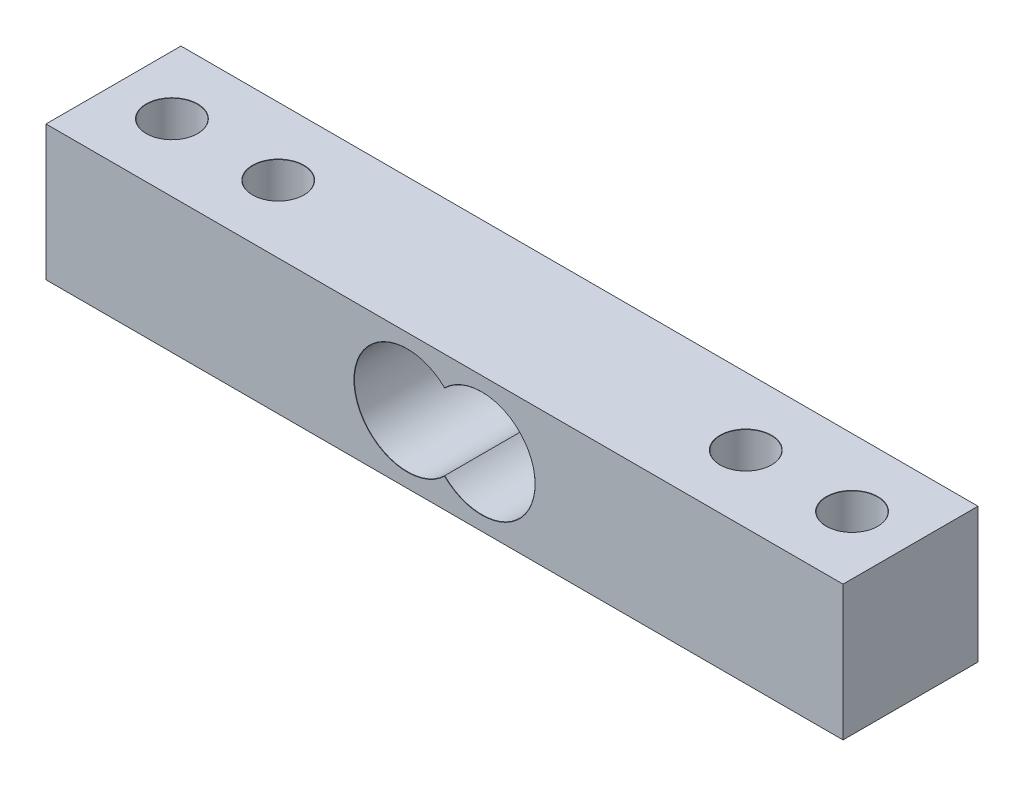
ISO-10303-21;
HEADER;
FILE_DESCRIPTION(('STEP AP214'),'2;1');
FILE_NAME('part.step','',(''),(''),'','','');
FILE_SCHEMA(('AUTOMOTIVE_DESIGN { 1 0 10303 214 1 1 1 1 }'));
ENDSEC;
DATA;
#1=APPLICATION_CONTEXT('core data for automotive mechanical design processes');
#2=APPLICATION_PROTOCOL_DEFINITION('international standard','automotive_design',2000,#1);
#3=PRODUCT_CONTEXT('',#1,'mechanical');
#4=PRODUCT('Part','Part','',(#3));
#5=PRODUCT_RELATED_PRODUCT_CATEGORY('part','',(#4));
#6=PRODUCT_DEFINITION_FORMATION('','',#4);
#7=PRODUCT_DEFINITION_CONTEXT('part definition',#1,'design');
#8=PRODUCT_DEFINITION('design','',#6,#7);
#9=PRODUCT_DEFINITION_SHAPE('','',#8);
#10=(LENGTH_UNIT() NAMED_UNIT(*) SI_UNIT(.MILLI.,.METRE.));
#11=(NAMED_UNIT(*) PLANE_ANGLE_UNIT() SI_UNIT($,.RADIAN.));
#12=(NAMED_UNIT(*) SI_UNIT($,.STERADIAN.) SOLID_ANGLE_UNIT());
#13=UNCERTAINTY_MEASURE_WITH_UNIT(LENGTH_MEASURE(1.E-05),#10,'distance_accuracy_value','');
#14=(GEOMETRIC_REPRESENTATION_CONTEXT(3) GLOBAL_UNCERTAINTY_ASSIGNED_CONTEXT((#13)) GLOBAL_UNIT_ASSIGNED_CONTEXT((#10,
#11,#12)) REPRESENTATION_CONTEXT('',''));
#15=CARTESIAN_POINT('',(0.,0.,0.));
#16=DIRECTION('',(0.,0.,1.));
#17=DIRECTION('',(1.,0.,0.));
#18=AXIS2_PLACEMENT_3D('',#15,#16,#17);
#19=CARTESIAN_POINT('',(37.5,12.7,6.35));
#20=DIRECTION('',(-1.,0.,0.));
#21=DIRECTION('',(0.,0.,1.));
#22=AXIS2_PLACEMENT_3D('',#19,#20,#21);
#23=PLANE('',#22);
#24=DIRECTION('',(0.,0.,-1.));
#25=VECTOR('',#24,1.);
#26=CARTESIAN_POINT('',(37.5,0.,6.35));
#27=LINE('',#26,#25);
#28=CARTESIAN_POINT('',(37.5,0.,6.35));
#29=VERTEX_POINT('',#28);
#30=CARTESIAN_POINT('',(37.5,0.,-6.35));
#31=VERTEX_POINT('',#30);
#32=EDGE_CURVE('E173',#29,#31,#27,.T.);
#33=ORIENTED_EDGE('',*,*,#32,.T.);
#34=DIRECTION('',(0.,-1.,0.));
#35=VECTOR('',#34,1.);
#36=CARTESIAN_POINT('',(37.5,12.7,-6.35));
#37=LINE('',#36,#35);
#38=CARTESIAN_POINT('',(37.5,12.7,-6.35));
#39=VERTEX_POINT('',#38);
#40=EDGE_CURVE('E194',#39,#31,#37,.T.);
#41=ORIENTED_EDGE('',*,*,#40,.F.);
#42=DIRECTION('',(0.,0.,-1.));
#43=VECTOR('',#42,1.);
#44=CARTESIAN_POINT('',(37.5,12.7,6.35));
#45=LINE('',#44,#43);
#46=CARTESIAN_POINT('',(37.5,12.7,6.35));
#47=VERTEX_POINT('',#46);
#48=EDGE_CURVE('E174',#47,#39,#45,.T.);
#49=ORIENTED_EDGE('',*,*,#48,.F.);
#50=DIRECTION('',(0.,-1.,0.));
#51=VECTOR('',#50,1.);
#52=CARTESIAN_POINT('',(37.5,12.7,6.35));
#53=LINE('',#52,#51);
#54=EDGE_CURVE('E180',#47,#29,#53,.T.);
#55=ORIENTED_EDGE('',*,*,#54,.T.);
#56=EDGE_LOOP('',(#33,#41,#49,#55));
#57=FACE_BOUND('',#56,.T.);
#58=ADVANCED_FACE('F40',(#57),#23,.F.);
#59=CARTESIAN_POINT('',(-37.5,12.7,-6.35));
#60=DIRECTION('',(0.,0.,1.));
#61=DIRECTION('',(1.,0.,0.));
#62=AXIS2_PLACEMENT_3D('',#59,#60,#61);
#63=PLANE('',#62);
#64=CARTESIAN_POINT('',(3.5,6.35,-6.35));
#65=DIRECTION('',(0.,0.,1.));
#66=DIRECTION('',(1.,0.,0.));
#67=AXIS2_PLACEMENT_3D('',#64,#65,#66);
#68=CIRCLE('',#67,5.);
#69=CARTESIAN_POINT('',(0.,2.77928578572858,-6.35));
#70=VERTEX_POINT('',#69);
#71=CARTESIAN_POINT('',(0.,9.92071421427142,-6.35));
#72=VERTEX_POINT('',#71);
#73=EDGE_CURVE('E131',#70,#72,#68,.T.);
#74=ORIENTED_EDGE('',*,*,#73,.T.);
#75=CARTESIAN_POINT('',(-3.5,6.35,-6.35));
#76=DIRECTION('',(0.,0.,1.));
#77=DIRECTION('',(1.,0.,0.));
#78=AXIS2_PLACEMENT_3D('',#75,#76,#77);
#79=CIRCLE('',#78,5.);
#80=EDGE_CURVE('E112',#72,#70,#79,.T.);
#81=ORIENTED_EDGE('',*,*,#80,.T.);
#82=EDGE_LOOP('',(#74,#81));
#83=FACE_BOUND('',#82,.T.);
#84=DIRECTION('',(-1.,0.,0.));
#85=VECTOR('',#84,1.);
#86=CARTESIAN_POINT('',(-37.5,0.,-6.35));
#87=LINE('',#86,#85);
#88=CARTESIAN_POINT('',(-37.5,0.,-6.35));
#89=VERTEX_POINT('',#88);
#90=EDGE_CURVE('E183',#31,#89,#87,.T.);
#91=ORIENTED_EDGE('',*,*,#90,.T.);
#92=DIRECTION('',(0.,-1.,0.));
#93=VECTOR('',#92,1.);
#94=CARTESIAN_POINT('',(-37.5,12.7,-6.35));
#95=LINE('',#94,#93);
#96=CARTESIAN_POINT('',(-37.5,12.7,-6.35));
#97=VERTEX_POINT('',#96);
#98=EDGE_CURVE('E191',#97,#89,#95,.T.);
#99=ORIENTED_EDGE('',*,*,#98,.F.);
#100=DIRECTION('',(-1.,0.,0.));
#101=VECTOR('',#100,1.);
#102=CARTESIAN_POINT('',(-37.5,12.7,-6.35));
#103=LINE('',#102,#101);
#104=EDGE_CURVE('E92',#39,#97,#103,.T.);
#105=ORIENTED_EDGE('',*,*,#104,.F.);
#106=ORIENTED_EDGE('',*,*,#40,.T.);
#107=EDGE_LOOP('',(#91,#99,#105,#106));
#108=FACE_BOUND('',#107,.T.);
#109=ADVANCED_FACE('F217',(#83,#108),#63,.F.);
#110=CARTESIAN_POINT('',(-37.5,12.7,6.35));
#111=DIRECTION('',(1.,0.,0.));
#112=DIRECTION('',(0.,0.,-1.));
#113=AXIS2_PLACEMENT_3D('',#110,#111,#112);
#114=PLANE('',#113);
#115=DIRECTION('',(0.,0.,1.));
#116=VECTOR('',#115,1.);
#117=CARTESIAN_POINT('',(-37.5,0.,6.35));
#118=LINE('',#117,#116);
#119=CARTESIAN_POINT('',(-37.5,0.,6.35));
#120=VERTEX_POINT('',#119);
#121=EDGE_CURVE('E185',#89,#120,#118,.T.);
#122=ORIENTED_EDGE('',*,*,#121,.T.);
#123=DIRECTION('',(0.,-1.,0.));
#124=VECTOR('',#123,1.);
#125=CARTESIAN_POINT('',(-37.5,12.7,6.35));
#126=LINE('',#125,#124);
#127=CARTESIAN_POINT('',(-37.5,12.7,6.35));
#128=VERTEX_POINT('',#127);
#129=EDGE_CURVE('E189',#128,#120,#126,.T.);
#130=ORIENTED_EDGE('',*,*,#129,.F.);
#131=DIRECTION('',(0.,0.,1.));
#132=VECTOR('',#131,1.);
#133=CARTESIAN_POINT('',(-37.5,12.7,6.35));
#134=LINE('',#133,#132);
#135=EDGE_CURVE('E177',#97,#128,#134,.T.);
#136=ORIENTED_EDGE('',*,*,#135,.F.);
#137=ORIENTED_EDGE('',*,*,#98,.T.);
#138=EDGE_LOOP('',(#122,#130,#136,#137));
#139=FACE_BOUND('',#138,.T.);
#140=ADVANCED_FACE('F223',(#139),#114,.F.);
#141=CARTESIAN_POINT('',(-37.5,12.7,6.35));
#142=DIRECTION('',(0.,0.,-1.));
#143=DIRECTION('',(-1.,0.,0.));
#144=AXIS2_PLACEMENT_3D('',#141,#142,#143);
#145=PLANE('',#144);
#146=CARTESIAN_POINT('',(3.5,6.35,6.35));
#147=DIRECTION('',(0.,0.,1.));
#148=DIRECTION('',(1.,0.,0.));
#149=AXIS2_PLACEMENT_3D('',#146,#147,#148);
#150=CIRCLE('',#149,5.025);
#151=CARTESIAN_POINT('',(0.,2.74436205367205,6.35));
#152=VERTEX_POINT('',#151);
#153=CARTESIAN_POINT('',(0.,9.95563794632795,6.35));
#154=VERTEX_POINT('',#153);
#155=EDGE_CURVE('E128',#152,#154,#150,.T.);
#156=ORIENTED_EDGE('',*,*,#155,.F.);
#157=CARTESIAN_POINT('',(-3.5,6.35,6.35));
#158=DIRECTION('',(0.,0.,1.));
#159=DIRECTION('',(1.,0.,0.));
#160=AXIS2_PLACEMENT_3D('',#157,#158,#159);
#161=CIRCLE('',#160,5.025);
#162=EDGE_CURVE('E54',#154,#152,#161,.T.);
#163=ORIENTED_EDGE('',*,*,#162,.F.);
#164=EDGE_LOOP('',(#156,#163));
#165=FACE_BOUND('',#164,.T.);
#166=DIRECTION('',(1.,0.,0.));
#167=VECTOR('',#166,1.);
#168=CARTESIAN_POINT('',(-37.5,0.,6.35));
#169=LINE('',#168,#167);
#170=EDGE_CURVE('E84',#120,#29,#169,.T.);
#171=ORIENTED_EDGE('',*,*,#170,.T.);
#172=ORIENTED_EDGE('',*,*,#54,.F.);
#173=DIRECTION('',(1.,0.,0.));
#174=VECTOR('',#173,1.);
#175=CARTESIAN_POINT('',(-37.5,12.7,6.35));
#176=LINE('',#175,#174);
#177=EDGE_CURVE('E63',#128,#47,#176,.T.);
#178=ORIENTED_EDGE('',*,*,#177,.F.);
#179=ORIENTED_EDGE('',*,*,#129,.T.);
#180=EDGE_LOOP('',(#171,#172,#178,#179));
#181=FACE_BOUND('',#180,.T.);
#182=ADVANCED_FACE('F236',(#165,#181),#145,.F.);
#183=CARTESIAN_POINT('',(0.,12.7,0.));
#184=DIRECTION('',(0.,-1.,0.));
#185=DIRECTION('',(0.,0.,-1.));
#186=AXIS2_PLACEMENT_3D('',#183,#184,#185);
#187=PLANE('',#186);
#188=CARTESIAN_POINT('',(-32.,12.7,0.));
#189=DIRECTION('',(0.,1.,0.));
#190=DIRECTION('',(0.,0.,1.));
#191=AXIS2_PLACEMENT_3D('',#188,#189,#190);
#192=CIRCLE('',#191,2.425);
#193=CARTESIAN_POINT('',(-32.,12.7,2.425));
#194=VERTEX_POINT('',#193);
#195=EDGE_CURVE('E133',#194,#194,#192,.T.);
#196=ORIENTED_EDGE('',*,*,#195,.F.);
#197=EDGE_LOOP('',(#196));
#198=FACE_BOUND('',#197,.T.);
#199=CARTESIAN_POINT('',(-22.,12.7,0.));
#200=DIRECTION('',(0.,1.,0.));
#201=DIRECTION('',(0.,0.,1.));
#202=AXIS2_PLACEMENT_3D('',#199,#200,#201);
#203=CIRCLE('',#202,2.425);
#204=CARTESIAN_POINT('',(-22.,12.7,2.425));
#205=VERTEX_POINT('',#204);
#206=EDGE_CURVE('E146',#205,#205,#203,.T.);
#207=ORIENTED_EDGE('',*,*,#206,.F.);
#208=EDGE_LOOP('',(#207));
#209=FACE_BOUND('',#208,.T.);
#210=CARTESIAN_POINT('',(22.,12.7,0.));
#211=DIRECTION('',(0.,1.,0.));
#212=DIRECTION('',(0.,0.,1.));
#213=AXIS2_PLACEMENT_3D('',#210,#211,#212);
#214=CIRCLE('',#213,2.425);
#215=CARTESIAN_POINT('',(22.,12.7,2.42499999999999));
#216=VERTEX_POINT('',#215);
#217=EDGE_CURVE('E155',#216,#216,#214,.T.);
#218=ORIENTED_EDGE('',*,*,#217,.F.);
#219=EDGE_LOOP('',(#218));
#220=FACE_BOUND('',#219,.T.);
#221=CARTESIAN_POINT('',(32.,12.7,0.));
#222=DIRECTION('',(0.,1.,0.));
#223=DIRECTION('',(0.,0.,1.));
#224=AXIS2_PLACEMENT_3D('',#221,#222,#223);
#225=CIRCLE('',#224,2.425);
#226=CARTESIAN_POINT('',(32.,12.7,2.425));
#227=VERTEX_POINT('',#226);
#228=EDGE_CURVE('E164',#227,#227,#225,.T.);
#229=ORIENTED_EDGE('',*,*,#228,.F.);
#230=EDGE_LOOP('',(#229));
#231=FACE_BOUND('',#230,.T.);
#232=ORIENTED_EDGE('',*,*,#48,.T.);
#233=ORIENTED_EDGE('',*,*,#104,.T.);
#234=ORIENTED_EDGE('',*,*,#135,.T.);
#235=ORIENTED_EDGE('',*,*,#177,.T.);
#236=EDGE_LOOP('',(#232,#233,#234,#235));
#237=FACE_BOUND('',#236,.T.);
#238=ADVANCED_FACE('F234',(#198,#209,#220,#231,#237),#187,.F.);
#239=CARTESIAN_POINT('',(0.,0.,0.));
#240=DIRECTION('',(0.,-1.,0.));
#241=DIRECTION('',(0.,0.,-1.));
#242=AXIS2_PLACEMENT_3D('',#239,#240,#241);
#243=PLANE('',#242);
#244=CARTESIAN_POINT('',(-32.,0.,0.));
#245=DIRECTION('',(0.,1.,0.));
#246=DIRECTION('',(0.,0.,1.));
#247=AXIS2_PLACEMENT_3D('',#244,#245,#246);
#248=CIRCLE('',#247,2.4);
#249=CARTESIAN_POINT('',(-32.,0.,2.4));
#250=VERTEX_POINT('',#249);
#251=EDGE_CURVE('E143',#250,#250,#248,.T.);
#252=ORIENTED_EDGE('',*,*,#251,.T.);
#253=EDGE_LOOP('',(#252));
#254=FACE_BOUND('',#253,.T.);
#255=CARTESIAN_POINT('',(-22.,0.,0.));
#256=DIRECTION('',(0.,1.,0.));
#257=DIRECTION('',(0.,0.,1.));
#258=AXIS2_PLACEMENT_3D('',#255,#256,#257);
#259=CIRCLE('',#258,2.4);
#260=CARTESIAN_POINT('',(-22.,0.,2.4));
#261=VERTEX_POINT('',#260);
#262=EDGE_CURVE('E152',#261,#261,#259,.T.);
#263=ORIENTED_EDGE('',*,*,#262,.T.);
#264=EDGE_LOOP('',(#263));
#265=FACE_BOUND('',#264,.T.);
#266=CARTESIAN_POINT('',(22.,0.,0.));
#267=DIRECTION('',(0.,1.,0.));
#268=DIRECTION('',(0.,0.,1.));
#269=AXIS2_PLACEMENT_3D('',#266,#267,#268);
#270=CIRCLE('',#269,2.4);
#271=CARTESIAN_POINT('',(22.,0.,2.39999999999999));
#272=VERTEX_POINT('',#271);
#273=EDGE_CURVE('E161',#272,#272,#270,.T.);
#274=ORIENTED_EDGE('',*,*,#273,.T.);
#275=EDGE_LOOP('',(#274));
#276=FACE_BOUND('',#275,.T.);
#277=CARTESIAN_POINT('',(32.,0.,0.));
#278=DIRECTION('',(0.,1.,0.));
#279=DIRECTION('',(0.,0.,1.));
#280=AXIS2_PLACEMENT_3D('',#277,#278,#279);
#281=CIRCLE('',#280,2.4);
#282=CARTESIAN_POINT('',(32.,0.,2.4));
#283=VERTEX_POINT('',#282);
#284=EDGE_CURVE('E170',#283,#283,#281,.T.);
#285=ORIENTED_EDGE('',*,*,#284,.T.);
#286=EDGE_LOOP('',(#285));
#287=FACE_BOUND('',#286,.T.);
#288=ORIENTED_EDGE('',*,*,#32,.F.);
#289=ORIENTED_EDGE('',*,*,#170,.F.);
#290=ORIENTED_EDGE('',*,*,#121,.F.);
#291=ORIENTED_EDGE('',*,*,#90,.F.);
#292=EDGE_LOOP('',(#288,#289,#290,#291));
#293=FACE_BOUND('',#292,.T.);
#294=ADVANCED_FACE('F229',(#254,#265,#276,#287,#293),#243,.T.);
#295=CARTESIAN_POINT('',(32.,12.7,0.));
#296=DIRECTION('',(0.,1.,0.));
#297=DIRECTION('',(0.,0.,1.));
#298=AXIS2_PLACEMENT_3D('',#295,#296,#297);
#299=CYLINDRICAL_SURFACE('',#298,2.4);
#300=ORIENTED_EDGE('',*,*,#284,.F.);
#301=EDGE_LOOP('',(#300));
#302=FACE_BOUND('',#301,.T.);
#303=CARTESIAN_POINT('',(32.,12.6790225092206,0.));
#304=DIRECTION('',(0.,1.,0.));
#305=DIRECTION('',(0.,0.,1.));
#306=AXIS2_PLACEMENT_3D('',#303,#304,#305);
#307=CIRCLE('',#306,2.4);
#308=CARTESIAN_POINT('',(32.,12.6790225092206,2.4));
#309=VERTEX_POINT('',#308);
#310=EDGE_CURVE('E167',#309,#309,#307,.T.);
#311=ORIENTED_EDGE('',*,*,#310,.T.);
#312=EDGE_LOOP('',(#311));
#313=FACE_BOUND('',#312,.T.);
#314=ADVANCED_FACE('F243',(#302,#313),#299,.F.);
#315=CARTESIAN_POINT('',(32.,12.7,0.));
#316=DIRECTION('',(0.,1.,0.));
#317=DIRECTION('',(0.,0.,1.));
#318=AXIS2_PLACEMENT_3D('',#315,#316,#317);
#319=CONICAL_SURFACE('',#318,2.425,0.87266462599705);
#320=ORIENTED_EDGE('',*,*,#310,.F.);
#321=EDGE_LOOP('',(#320));
#322=FACE_BOUND('',#321,.T.);
#323=ORIENTED_EDGE('',*,*,#228,.T.);
#324=EDGE_LOOP('',(#323));
#325=FACE_BOUND('',#324,.T.);
#326=ADVANCED_FACE('F287',(#322,#325),#319,.F.);
#327=CARTESIAN_POINT('',(22.,12.7,0.));
#328=DIRECTION('',(0.,1.,0.));
#329=DIRECTION('',(0.,0.,1.));
#330=AXIS2_PLACEMENT_3D('',#327,#328,#329);
#331=CYLINDRICAL_SURFACE('',#330,2.4);
#332=ORIENTED_EDGE('',*,*,#273,.F.);
#333=EDGE_LOOP('',(#332));
#334=FACE_BOUND('',#333,.T.);
#335=CARTESIAN_POINT('',(22.,12.6790225092206,0.));
#336=DIRECTION('',(0.,1.,0.));
#337=DIRECTION('',(0.,0.,1.));
#338=AXIS2_PLACEMENT_3D('',#335,#336,#337);
#339=CIRCLE('',#338,2.4);
#340=CARTESIAN_POINT('',(22.,12.6790225092206,2.39999999999999));
#341=VERTEX_POINT('',#340);
#342=EDGE_CURVE('E158',#341,#341,#339,.T.);
#343=ORIENTED_EDGE('',*,*,#342,.T.);
#344=EDGE_LOOP('',(#343));
#345=FACE_BOUND('',#344,.T.);
#346=ADVANCED_FACE('F296',(#334,#345),#331,.F.);
#347=CARTESIAN_POINT('',(22.,12.7,0.));
#348=DIRECTION('',(0.,1.,0.));
#349=DIRECTION('',(0.,0.,1.));
#350=AXIS2_PLACEMENT_3D('',#347,#348,#349);
#351=CONICAL_SURFACE('',#350,2.425,0.872664625997118);
#352=ORIENTED_EDGE('',*,*,#342,.F.);
#353=EDGE_LOOP('',(#352));
#354=FACE_BOUND('',#353,.T.);
#355=ORIENTED_EDGE('',*,*,#217,.T.);
#356=EDGE_LOOP('',(#355));
#357=FACE_BOUND('',#356,.T.);
#358=ADVANCED_FACE('F305',(#354,#357),#351,.F.);
#359=CARTESIAN_POINT('',(-22.,12.7,0.));
#360=DIRECTION('',(0.,1.,0.));
#361=DIRECTION('',(0.,0.,1.));
#362=AXIS2_PLACEMENT_3D('',#359,#360,#361);
#363=CYLINDRICAL_SURFACE('',#362,2.4);
#364=ORIENTED_EDGE('',*,*,#262,.F.);
#365=EDGE_LOOP('',(#364));
#366=FACE_BOUND('',#365,.T.);
#367=CARTESIAN_POINT('',(-22.,12.6790225092206,0.));
#368=DIRECTION('',(0.,1.,0.));
#369=DIRECTION('',(0.,0.,1.));
#370=AXIS2_PLACEMENT_3D('',#367,#368,#369);
#371=CIRCLE('',#370,2.4);
#372=CARTESIAN_POINT('',(-22.,12.6790225092206,2.4));
#373=VERTEX_POINT('',#372);
#374=EDGE_CURVE('E149',#373,#373,#371,.T.);
#375=ORIENTED_EDGE('',*,*,#374,.T.);
#376=EDGE_LOOP('',(#375));
#377=FACE_BOUND('',#376,.T.);
#378=ADVANCED_FACE('F315',(#366,#377),#363,.F.);
#379=CARTESIAN_POINT('',(-22.,12.7,0.));
#380=DIRECTION('',(0.,1.,0.));
#381=DIRECTION('',(0.,0.,1.));
#382=AXIS2_PLACEMENT_3D('',#379,#380,#381);
#383=CONICAL_SURFACE('',#382,2.425,0.872664625997118);
#384=ORIENTED_EDGE('',*,*,#374,.F.);
#385=EDGE_LOOP('',(#384));
#386=FACE_BOUND('',#385,.T.);
#387=ORIENTED_EDGE('',*,*,#206,.T.);
#388=EDGE_LOOP('',(#387));
#389=FACE_BOUND('',#388,.T.);
#390=ADVANCED_FACE('F325',(#386,#389),#383,.F.);
#391=CARTESIAN_POINT('',(-32.,12.7,0.));
#392=DIRECTION('',(0.,1.,0.));
#393=DIRECTION('',(0.,0.,1.));
#394=AXIS2_PLACEMENT_3D('',#391,#392,#393);
#395=CYLINDRICAL_SURFACE('',#394,2.4);
#396=ORIENTED_EDGE('',*,*,#251,.F.);
#397=EDGE_LOOP('',(#396));
#398=FACE_BOUND('',#397,.T.);
#399=CARTESIAN_POINT('',(-32.,12.6790225092206,0.));
#400=DIRECTION('',(0.,1.,0.));
#401=DIRECTION('',(0.,0.,1.));
#402=AXIS2_PLACEMENT_3D('',#399,#400,#401);
#403=CIRCLE('',#402,2.4);
#404=CARTESIAN_POINT('',(-32.,12.6790225092206,2.4));
#405=VERTEX_POINT('',#404);
#406=EDGE_CURVE('E140',#405,#405,#403,.T.);
#407=ORIENTED_EDGE('',*,*,#406,.T.);
#408=EDGE_LOOP('',(#407));
#409=FACE_BOUND('',#408,.T.);
#410=ADVANCED_FACE('F335',(#398,#409),#395,.F.);
#411=CARTESIAN_POINT('',(-32.,12.7,0.));
#412=DIRECTION('',(0.,1.,0.));
#413=DIRECTION('',(0.,0.,1.));
#414=AXIS2_PLACEMENT_3D('',#411,#412,#413);
#415=CONICAL_SURFACE('',#414,2.425,0.872664625997118);
#416=ORIENTED_EDGE('',*,*,#406,.F.);
#417=EDGE_LOOP('',(#416));
#418=FACE_BOUND('',#417,.T.);
#419=ORIENTED_EDGE('',*,*,#195,.T.);
#420=EDGE_LOOP('',(#419));
#421=FACE_BOUND('',#420,.T.);
#422=ADVANCED_FACE('F345',(#418,#421),#415,.F.);
#423=CARTESIAN_POINT('',(3.5,6.35,6.35));
#424=DIRECTION('',(0.,0.,1.));
#425=DIRECTION('',(1.,0.,0.));
#426=AXIS2_PLACEMENT_3D('',#423,#424,#425);
#427=CYLINDRICAL_SURFACE('',#426,5.);
#428=ORIENTED_EDGE('',*,*,#73,.F.);
#429=DIRECTION('',(0.,0.,1.));
#430=VECTOR('',#429,1.);
#431=CARTESIAN_POINT('',(0.,2.77928578572858,-0.0104887453897173));
#432=LINE('',#431,#430);
#433=CARTESIAN_POINT('',(0.,2.77928578572858,6.32902250922057));
#434=VERTEX_POINT('',#433);
#435=EDGE_CURVE('E11',#70,#434,#432,.T.);
#436=ORIENTED_EDGE('',*,*,#435,.T.);
#437=CARTESIAN_POINT('',(3.5,6.35,6.32902250922057));
#438=DIRECTION('',(0.,0.,1.));
#439=DIRECTION('',(1.,0.,0.));
#440=AXIS2_PLACEMENT_3D('',#437,#438,#439);
#441=CIRCLE('',#440,5.);
#442=CARTESIAN_POINT('',(0.,9.92071421427142,6.32902250922057));
#443=VERTEX_POINT('',#442);
#444=EDGE_CURVE('E126',#434,#443,#441,.T.);
#445=ORIENTED_EDGE('',*,*,#444,.T.);
#446=DIRECTION('',(0.,0.,1.));
#447=VECTOR('',#446,1.);
#448=CARTESIAN_POINT('',(0.,9.92071421427142,-0.0104887453897173));
#449=LINE('',#448,#447);
#450=EDGE_CURVE('E47',#443,#72,#449,.F.);
#451=ORIENTED_EDGE('',*,*,#450,.T.);
#452=EDGE_LOOP('',(#428,#436,#445,#451));
#453=FACE_BOUND('',#452,.T.);
#454=ADVANCED_FACE('F130',(#453),#427,.F.);
#455=CARTESIAN_POINT('',(3.5,6.35,6.35));
#456=DIRECTION('',(0.,0.,1.));
#457=DIRECTION('',(1.,0.,0.));
#458=AXIS2_PLACEMENT_3D('',#455,#456,#457);
#459=CONICAL_SURFACE('',#458,5.025,0.872664625997152);
#460=ORIENTED_EDGE('',*,*,#155,.T.);
#461=CARTESIAN_POINT('',(0.,9.95597011656117,6.3502));
#462=CARTESIAN_POINT('',(0.,9.95004230803107,6.34663075398195));
#463=CARTESIAN_POINT('',(0.,9.94411259812668,6.34306467340927));
#464=CARTESIAN_POINT('',(0.,9.93224937556076,6.33593884314944));
#465=CARTESIAN_POINT('',(0.,9.92631586289921,6.33237909346232));
#466=CARTESIAN_POINT('',(0.,9.92038044886338,6.32882250922057));
#467=B_SPLINE_CURVE_WITH_KNOTS('',3,(#461,#462,#463,#464,#465,#466),.UNSPECIFIED.,.F.,.F.,(4,2,
4),(0.,0.0207582636993012,0.0415165274286483),.UNSPECIFIED.);
#468=EDGE_CURVE('E117',#154,#443,#467,.T.);
#469=ORIENTED_EDGE('',*,*,#468,.T.);
#470=ORIENTED_EDGE('',*,*,#444,.F.);
#471=CARTESIAN_POINT('',(0.,2.77961955113662,6.32882250922057));
#472=CARTESIAN_POINT('',(0.,2.77368413710079,6.33237909346232));
#473=CARTESIAN_POINT('',(0.,2.76775062443924,6.33593884314944));
#474=CARTESIAN_POINT('',(0.,2.75588740187332,6.34306467340926));
#475=CARTESIAN_POINT('',(0.,2.74995769196893,6.34663075398195));
#476=CARTESIAN_POINT('',(0.,2.74402988343883,6.3502));
#477=B_SPLINE_CURVE_WITH_KNOTS('',3,(#471,#472,#473,#474,#475,#476),.UNSPECIFIED.,.F.,.F.,(4,2,
4),(0.,0.0207582637293475,0.0415165274286479),.UNSPECIFIED.);
#478=EDGE_CURVE('E120',#434,#152,#477,.T.);
#479=ORIENTED_EDGE('',*,*,#478,.T.);
#480=EDGE_LOOP('',(#460,#469,#470,#479));
#481=FACE_BOUND('',#480,.T.);
#482=ADVANCED_FACE('F125',(#481),#459,.F.);
#483=CARTESIAN_POINT('',(-3.5,6.35,6.35));
#484=DIRECTION('',(0.,0.,1.));
#485=DIRECTION('',(1.,0.,0.));
#486=AXIS2_PLACEMENT_3D('',#483,#484,#485);
#487=CYLINDRICAL_SURFACE('',#486,5.);
#488=ORIENTED_EDGE('',*,*,#80,.F.);
#489=ORIENTED_EDGE('',*,*,#450,.F.);
#490=CARTESIAN_POINT('',(-3.5,6.35,6.32902250922057));
#491=DIRECTION('',(0.,0.,1.));
#492=DIRECTION('',(1.,0.,0.));
#493=AXIS2_PLACEMENT_3D('',#490,#491,#492);
#494=CIRCLE('',#493,5.);
#495=EDGE_CURVE('E110',#443,#434,#494,.T.);
#496=ORIENTED_EDGE('',*,*,#495,.T.);
#497=ORIENTED_EDGE('',*,*,#435,.F.);
#498=EDGE_LOOP('',(#488,#489,#496,#497));
#499=FACE_BOUND('',#498,.T.);
#500=ADVANCED_FACE('F109',(#499),#487,.F.);
#501=CARTESIAN_POINT('',(-3.5,6.35,6.35));
#502=DIRECTION('',(0.,0.,1.));
#503=DIRECTION('',(1.,0.,0.));
#504=AXIS2_PLACEMENT_3D('',#501,#502,#503);
#505=CONICAL_SURFACE('',#504,5.025,0.872664625997152);
#506=ORIENTED_EDGE('',*,*,#162,.T.);
#507=ORIENTED_EDGE('',*,*,#478,.F.);
#508=ORIENTED_EDGE('',*,*,#495,.F.);
#509=ORIENTED_EDGE('',*,*,#468,.F.);
#510=EDGE_LOOP('',(#506,#507,#508,#509));
#511=FACE_BOUND('',#510,.T.);
#512=ADVANCED_FACE('F119',(#511),#505,.F.);
#513=CLOSED_SHELL('',(#58,#109,#140,#182,#238,#294,#314,#326,#346,#358,#378,#390,#410,#422,#454,
#482,#500,#512));
#514=MANIFOLD_SOLID_BREP('B2',#513);
#515=ADVANCED_BREP_SHAPE_REPRESENTATION('',(#18,#514),#14);
#516=SHAPE_DEFINITION_REPRESENTATION(#9,#515);
ENDSEC;
END-ISO-10303-21;
